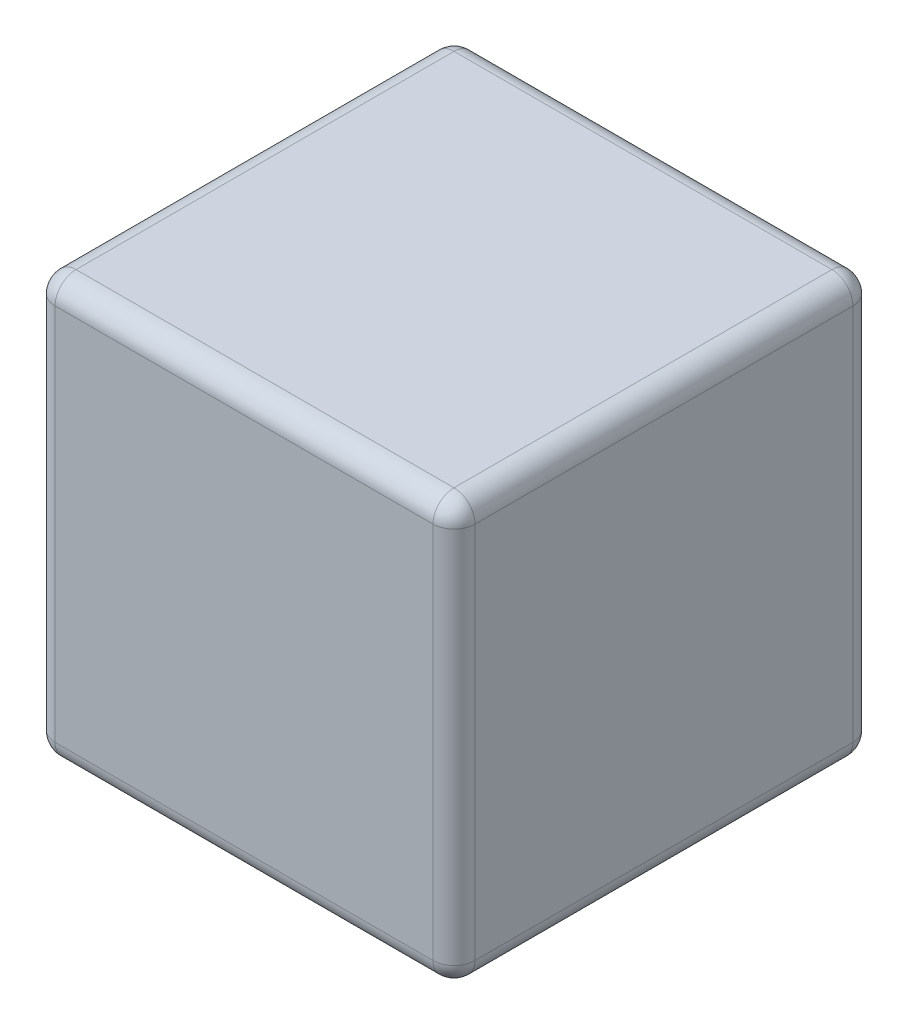
ISO-10303-21;
HEADER;
FILE_DESCRIPTION(('STEP AP214'),'2;1');
FILE_NAME('part.step','',(''),(''),'','','');
FILE_SCHEMA(('AUTOMOTIVE_DESIGN { 1 0 10303 214 1 1 1 1 }'));
ENDSEC;
DATA;
#1=APPLICATION_CONTEXT('core data for automotive mechanical design processes');
#2=APPLICATION_PROTOCOL_DEFINITION('international standard','automotive_design',2000,#1);
#3=PRODUCT_CONTEXT('',#1,'mechanical');
#4=PRODUCT('Part','Part','',(#3));
#5=PRODUCT_RELATED_PRODUCT_CATEGORY('part','',(#4));
#6=PRODUCT_DEFINITION_FORMATION('','',#4);
#7=PRODUCT_DEFINITION_CONTEXT('part definition',#1,'design');
#8=PRODUCT_DEFINITION('design','',#6,#7);
#9=PRODUCT_DEFINITION_SHAPE('','',#8);
#10=(LENGTH_UNIT() NAMED_UNIT(*) SI_UNIT(.MILLI.,.METRE.));
#11=(NAMED_UNIT(*) PLANE_ANGLE_UNIT() SI_UNIT($,.RADIAN.));
#12=(NAMED_UNIT(*) SI_UNIT($,.STERADIAN.) SOLID_ANGLE_UNIT());
#13=UNCERTAINTY_MEASURE_WITH_UNIT(LENGTH_MEASURE(1.E-05),#10,'distance_accuracy_value','');
#14=(GEOMETRIC_REPRESENTATION_CONTEXT(3) GLOBAL_UNCERTAINTY_ASSIGNED_CONTEXT((#13)) GLOBAL_UNIT_ASSIGNED_CONTEXT((#10,
#11,#12)) REPRESENTATION_CONTEXT('',''));
#15=CARTESIAN_POINT('',(0.,0.,0.));
#16=DIRECTION('',(0.,0.,1.));
#17=DIRECTION('',(1.,0.,0.));
#18=AXIS2_PLACEMENT_3D('',#15,#16,#17);
#19=CARTESIAN_POINT('',(-5.,-5.,5.));
#20=DIRECTION('',(0.,0.,1.));
#21=DIRECTION('',(1.,0.,0.));
#22=AXIS2_PLACEMENT_3D('',#19,#20,#21);
#23=PLANE('',#22);
#24=DIRECTION('',(0.,1.,0.));
#25=VECTOR('',#24,1.);
#26=CARTESIAN_POINT('',(-4.5,-5.,5.));
#27=LINE('',#26,#25);
#28=CARTESIAN_POINT('',(-4.5,4.5,5.));
#29=VERTEX_POINT('',#28);
#30=CARTESIAN_POINT('',(-4.5,-4.5,5.));
#31=VERTEX_POINT('',#30);
#32=EDGE_CURVE('E185',#29,#31,#27,.F.);
#33=ORIENTED_EDGE('',*,*,#32,.T.);
#34=DIRECTION('',(1.,0.,0.));
#35=VECTOR('',#34,1.);
#36=CARTESIAN_POINT('',(5.,-4.5,5.));
#37=LINE('',#36,#35);
#38=CARTESIAN_POINT('',(4.5,-4.5,5.));
#39=VERTEX_POINT('',#38);
#40=EDGE_CURVE('E139',#31,#39,#37,.T.);
#41=ORIENTED_EDGE('',*,*,#40,.T.);
#42=DIRECTION('',(0.,1.,0.));
#43=VECTOR('',#42,1.);
#44=CARTESIAN_POINT('',(4.5,-5.,5.));
#45=LINE('',#44,#43);
#46=CARTESIAN_POINT('',(4.5,4.5,5.));
#47=VERTEX_POINT('',#46);
#48=EDGE_CURVE('E187',#39,#47,#45,.T.);
#49=ORIENTED_EDGE('',*,*,#48,.T.);
#50=DIRECTION('',(1.,0.,0.));
#51=VECTOR('',#50,1.);
#52=CARTESIAN_POINT('',(-5.,4.5,5.));
#53=LINE('',#52,#51);
#54=EDGE_CURVE('E183',#47,#29,#53,.F.);
#55=ORIENTED_EDGE('',*,*,#54,.T.);
#56=EDGE_LOOP('',(#33,#41,#49,#55));
#57=FACE_BOUND('',#56,.T.);
#58=ADVANCED_FACE('F33',(#57),#23,.T.);
#59=CARTESIAN_POINT('',(-5.,-5.,5.));
#60=DIRECTION('',(1.,0.,0.));
#61=DIRECTION('',(0.,0.,-1.));
#62=AXIS2_PLACEMENT_3D('',#59,#60,#61);
#63=PLANE('',#62);
#64=DIRECTION('',(0.,1.,0.));
#65=VECTOR('',#64,1.);
#66=CARTESIAN_POINT('',(-5.,-5.,-4.5));
#67=LINE('',#66,#65);
#68=CARTESIAN_POINT('',(-5.,4.5,-4.5));
#69=VERTEX_POINT('',#68);
#70=CARTESIAN_POINT('',(-5.,-4.5,-4.5));
#71=VERTEX_POINT('',#70);
#72=EDGE_CURVE('E194',#69,#71,#67,.F.);
#73=ORIENTED_EDGE('',*,*,#72,.T.);
#74=DIRECTION('',(0.,0.,-1.));
#75=VECTOR('',#74,1.);
#76=CARTESIAN_POINT('',(-5.,-4.5,5.));
#77=LINE('',#76,#75);
#78=CARTESIAN_POINT('',(-5.,-4.5,4.5));
#79=VERTEX_POINT('',#78);
#80=EDGE_CURVE('E196',#71,#79,#77,.F.);
#81=ORIENTED_EDGE('',*,*,#80,.T.);
#82=DIRECTION('',(0.,1.,0.));
#83=VECTOR('',#82,1.);
#84=CARTESIAN_POINT('',(-5.,5.,4.5));
#85=LINE('',#84,#83);
#86=CARTESIAN_POINT('',(-5.,4.5,4.5));
#87=VERTEX_POINT('',#86);
#88=EDGE_CURVE('E192',#79,#87,#85,.T.);
#89=ORIENTED_EDGE('',*,*,#88,.T.);
#90=DIRECTION('',(0.,0.,-1.));
#91=VECTOR('',#90,1.);
#92=CARTESIAN_POINT('',(-5.,4.5,-5.));
#93=LINE('',#92,#91);
#94=EDGE_CURVE('E190',#87,#69,#93,.T.);
#95=ORIENTED_EDGE('',*,*,#94,.T.);
#96=EDGE_LOOP('',(#73,#81,#89,#95));
#97=FACE_BOUND('',#96,.T.);
#98=ADVANCED_FACE('F300',(#97),#63,.F.);
#99=CARTESIAN_POINT('',(-5.,-5.,-5.));
#100=DIRECTION('',(0.,0.,1.));
#101=DIRECTION('',(1.,0.,0.));
#102=AXIS2_PLACEMENT_3D('',#99,#100,#101);
#103=PLANE('',#102);
#104=DIRECTION('',(0.,1.,0.));
#105=VECTOR('',#104,1.);
#106=CARTESIAN_POINT('',(4.5,-5.,-5.));
#107=LINE('',#106,#105);
#108=CARTESIAN_POINT('',(4.5,4.5,-5.));
#109=VERTEX_POINT('',#108);
#110=CARTESIAN_POINT('',(4.5,-4.5,-5.));
#111=VERTEX_POINT('',#110);
#112=EDGE_CURVE('E169',#109,#111,#107,.F.);
#113=ORIENTED_EDGE('',*,*,#112,.T.);
#114=DIRECTION('',(1.,0.,0.));
#115=VECTOR('',#114,1.);
#116=CARTESIAN_POINT('',(-5.,-4.5,-5.));
#117=LINE('',#116,#115);
#118=CARTESIAN_POINT('',(-4.5,-4.5,-5.));
#119=VERTEX_POINT('',#118);
#120=EDGE_CURVE('E171',#111,#119,#117,.F.);
#121=ORIENTED_EDGE('',*,*,#120,.T.);
#122=DIRECTION('',(0.,1.,0.));
#123=VECTOR('',#122,1.);
#124=CARTESIAN_POINT('',(-4.5,-5.,-5.));
#125=LINE('',#124,#123);
#126=CARTESIAN_POINT('',(-4.5,4.5,-5.));
#127=VERTEX_POINT('',#126);
#128=EDGE_CURVE('E167',#119,#127,#125,.T.);
#129=ORIENTED_EDGE('',*,*,#128,.T.);
#130=DIRECTION('',(1.,0.,0.));
#131=VECTOR('',#130,1.);
#132=CARTESIAN_POINT('',(5.,4.5,-5.));
#133=LINE('',#132,#131);
#134=EDGE_CURVE('E165',#127,#109,#133,.T.);
#135=ORIENTED_EDGE('',*,*,#134,.T.);
#136=EDGE_LOOP('',(#113,#121,#129,#135));
#137=FACE_BOUND('',#136,.T.);
#138=ADVANCED_FACE('F305',(#137),#103,.F.);
#139=CARTESIAN_POINT('',(5.,-5.,5.));
#140=DIRECTION('',(1.,0.,0.));
#141=DIRECTION('',(0.,0.,-1.));
#142=AXIS2_PLACEMENT_3D('',#139,#140,#141);
#143=PLANE('',#142);
#144=DIRECTION('',(0.,1.,0.));
#145=VECTOR('',#144,1.);
#146=CARTESIAN_POINT('',(5.,-5.,4.5));
#147=LINE('',#146,#145);
#148=CARTESIAN_POINT('',(5.,4.5,4.5));
#149=VERTEX_POINT('',#148);
#150=CARTESIAN_POINT('',(5.,-4.5,4.5));
#151=VERTEX_POINT('',#150);
#152=EDGE_CURVE('E176',#149,#151,#147,.F.);
#153=ORIENTED_EDGE('',*,*,#152,.T.);
#154=DIRECTION('',(0.,0.,-1.));
#155=VECTOR('',#154,1.);
#156=CARTESIAN_POINT('',(5.,-4.5,-5.));
#157=LINE('',#156,#155);
#158=CARTESIAN_POINT('',(5.,-4.5,-4.5));
#159=VERTEX_POINT('',#158);
#160=EDGE_CURVE('E180',#151,#159,#157,.T.);
#161=ORIENTED_EDGE('',*,*,#160,.T.);
#162=DIRECTION('',(0.,1.,0.));
#163=VECTOR('',#162,1.);
#164=CARTESIAN_POINT('',(5.,5.,-4.5));
#165=LINE('',#164,#163);
#166=CARTESIAN_POINT('',(5.,4.5,-4.5));
#167=VERTEX_POINT('',#166);
#168=EDGE_CURVE('E178',#159,#167,#165,.T.);
#169=ORIENTED_EDGE('',*,*,#168,.T.);
#170=DIRECTION('',(0.,0.,-1.));
#171=VECTOR('',#170,1.);
#172=CARTESIAN_POINT('',(5.,4.5,5.));
#173=LINE('',#172,#171);
#174=EDGE_CURVE('E174',#167,#149,#173,.F.);
#175=ORIENTED_EDGE('',*,*,#174,.T.);
#176=EDGE_LOOP('',(#153,#161,#169,#175));
#177=FACE_BOUND('',#176,.T.);
#178=ADVANCED_FACE('F265',(#177),#143,.T.);
#179=CARTESIAN_POINT('',(0.,-5.,0.));
#180=DIRECTION('',(0.,1.,0.));
#181=DIRECTION('',(0.,0.,1.));
#182=AXIS2_PLACEMENT_3D('',#179,#180,#181);
#183=PLANE('',#182);
#184=DIRECTION('',(0.,0.,-1.));
#185=VECTOR('',#184,1.);
#186=CARTESIAN_POINT('',(-4.5,-5.,0.));
#187=LINE('',#186,#185);
#188=CARTESIAN_POINT('',(-4.5,-5.,4.5));
#189=VERTEX_POINT('',#188);
#190=CARTESIAN_POINT('',(-4.5,-5.,-4.5));
#191=VERTEX_POINT('',#190);
#192=EDGE_CURVE('E125',#189,#191,#187,.T.);
#193=ORIENTED_EDGE('',*,*,#192,.T.);
#194=DIRECTION('',(1.,0.,0.));
#195=VECTOR('',#194,1.);
#196=CARTESIAN_POINT('',(0.,-5.,-4.5));
#197=LINE('',#196,#195);
#198=CARTESIAN_POINT('',(4.5,-5.,-4.5));
#199=VERTEX_POINT('',#198);
#200=EDGE_CURVE('E163',#191,#199,#197,.T.);
#201=ORIENTED_EDGE('',*,*,#200,.T.);
#202=DIRECTION('',(0.,0.,-1.));
#203=VECTOR('',#202,1.);
#204=CARTESIAN_POINT('',(4.5,-5.,5.));
#205=LINE('',#204,#203);
#206=CARTESIAN_POINT('',(4.5,-5.,4.5));
#207=VERTEX_POINT('',#206);
#208=EDGE_CURVE('E128',#199,#207,#205,.F.);
#209=ORIENTED_EDGE('',*,*,#208,.T.);
#210=DIRECTION('',(1.,0.,0.));
#211=VECTOR('',#210,1.);
#212=CARTESIAN_POINT('',(-5.,-5.,4.5));
#213=LINE('',#212,#211);
#214=EDGE_CURVE('E120',#207,#189,#213,.F.);
#215=ORIENTED_EDGE('',*,*,#214,.T.);
#216=EDGE_LOOP('',(#193,#201,#209,#215));
#217=FACE_BOUND('',#216,.T.);
#218=ADVANCED_FACE('F122',(#217),#183,.F.);
#219=CARTESIAN_POINT('',(0.,5.,0.));
#220=DIRECTION('',(0.,1.,0.));
#221=DIRECTION('',(0.,0.,1.));
#222=AXIS2_PLACEMENT_3D('',#219,#220,#221);
#223=PLANE('',#222);
#224=DIRECTION('',(1.,0.,0.));
#225=VECTOR('',#224,1.);
#226=CARTESIAN_POINT('',(-5.,5.,-4.5));
#227=LINE('',#226,#225);
#228=CARTESIAN_POINT('',(4.5,5.,-4.5));
#229=VERTEX_POINT('',#228);
#230=CARTESIAN_POINT('',(-4.5,5.,-4.5));
#231=VERTEX_POINT('',#230);
#232=EDGE_CURVE('E42',#229,#231,#227,.F.);
#233=ORIENTED_EDGE('',*,*,#232,.T.);
#234=DIRECTION('',(0.,0.,-1.));
#235=VECTOR('',#234,1.);
#236=CARTESIAN_POINT('',(-4.5,5.,5.));
#237=LINE('',#236,#235);
#238=CARTESIAN_POINT('',(-4.5,5.,4.5));
#239=VERTEX_POINT('',#238);
#240=EDGE_CURVE('E11',#231,#239,#237,.F.);
#241=ORIENTED_EDGE('',*,*,#240,.T.);
#242=DIRECTION('',(1.,0.,0.));
#243=VECTOR('',#242,1.);
#244=CARTESIAN_POINT('',(0.,5.,4.5));
#245=LINE('',#244,#243);
#246=CARTESIAN_POINT('',(4.5,5.,4.5));
#247=VERTEX_POINT('',#246);
#248=EDGE_CURVE('E199',#239,#247,#245,.T.);
#249=ORIENTED_EDGE('',*,*,#248,.T.);
#250=DIRECTION('',(0.,0.,-1.));
#251=VECTOR('',#250,1.);
#252=CARTESIAN_POINT('',(4.5,5.,0.));
#253=LINE('',#252,#251);
#254=EDGE_CURVE('E53',#247,#229,#253,.T.);
#255=ORIENTED_EDGE('',*,*,#254,.T.);
#256=EDGE_LOOP('',(#233,#241,#249,#255));
#257=FACE_BOUND('',#256,.T.);
#258=ADVANCED_FACE('F290',(#257),#223,.T.);
#259=CARTESIAN_POINT('',(0.,4.5,4.5));
#260=DIRECTION('',(1.,0.,0.));
#261=DIRECTION('',(0.,0.,-1.));
#262=AXIS2_PLACEMENT_3D('',#259,#260,#261);
#263=CYLINDRICAL_SURFACE('',#262,0.5);
#264=CARTESIAN_POINT('',(-4.5,4.5,4.5));
#265=DIRECTION('',(-1.,0.,0.));
#266=DIRECTION('',(0.,0.,1.));
#267=AXIS2_PLACEMENT_3D('',#264,#265,#266);
#268=CIRCLE('',#267,0.5);
#269=EDGE_CURVE('E37',#29,#239,#268,.T.);
#270=ORIENTED_EDGE('',*,*,#269,.F.);
#271=ORIENTED_EDGE('',*,*,#54,.F.);
#272=CARTESIAN_POINT('',(4.5,4.5,4.5));
#273=DIRECTION('',(1.,0.,0.));
#274=DIRECTION('',(0.,0.,-1.));
#275=AXIS2_PLACEMENT_3D('',#272,#273,#274);
#276=CIRCLE('',#275,0.5);
#277=EDGE_CURVE('E160',#247,#47,#276,.T.);
#278=ORIENTED_EDGE('',*,*,#277,.F.);
#279=ORIENTED_EDGE('',*,*,#248,.F.);
#280=EDGE_LOOP('',(#270,#271,#278,#279));
#281=FACE_BOUND('',#280,.T.);
#282=ADVANCED_FACE('F35',(#281),#263,.T.);
#283=CARTESIAN_POINT('',(-4.5,4.5,4.5));
#284=DIRECTION('',(0.,0.,1.));
#285=DIRECTION('',(1.,0.,0.));
#286=AXIS2_PLACEMENT_3D('',#283,#284,#285);
#287=SPHERICAL_SURFACE('',#286,0.5);
#288=CARTESIAN_POINT('',(-4.5,4.5,4.5));
#289=DIRECTION('',(0.,1.,0.));
#290=DIRECTION('',(0.,0.,1.));
#291=AXIS2_PLACEMENT_3D('',#288,#289,#290);
#292=CIRCLE('',#291,0.5);
#293=EDGE_CURVE('E245',#29,#87,#292,.F.);
#294=ORIENTED_EDGE('',*,*,#293,.F.);
#295=ORIENTED_EDGE('',*,*,#269,.T.);
#296=CARTESIAN_POINT('',(-4.5,4.5,4.5));
#297=DIRECTION('',(0.,0.,1.));
#298=DIRECTION('',(1.,0.,0.));
#299=AXIS2_PLACEMENT_3D('',#296,#297,#298);
#300=CIRCLE('',#299,0.5);
#301=EDGE_CURVE('E248',#87,#239,#300,.F.);
#302=ORIENTED_EDGE('',*,*,#301,.F.);
#303=EDGE_LOOP('',(#294,#295,#302));
#304=FACE_BOUND('',#303,.T.);
#305=ADVANCED_FACE('F295',(#304),#287,.T.);
#306=CARTESIAN_POINT('',(4.5,4.5,4.5));
#307=DIRECTION('',(0.,0.,1.));
#308=DIRECTION('',(1.,0.,0.));
#309=AXIS2_PLACEMENT_3D('',#306,#307,#308);
#310=SPHERICAL_SURFACE('',#309,0.5);
#311=CARTESIAN_POINT('',(4.5,4.5,4.5));
#312=DIRECTION('',(0.,0.,1.));
#313=DIRECTION('',(1.,0.,0.));
#314=AXIS2_PLACEMENT_3D('',#311,#312,#313);
#315=CIRCLE('',#314,0.5);
#316=EDGE_CURVE('E239',#247,#149,#315,.F.);
#317=ORIENTED_EDGE('',*,*,#316,.F.);
#318=ORIENTED_EDGE('',*,*,#277,.T.);
#319=CARTESIAN_POINT('',(4.5,4.5,4.5));
#320=DIRECTION('',(0.,1.,0.));
#321=DIRECTION('',(0.,0.,1.));
#322=AXIS2_PLACEMENT_3D('',#319,#320,#321);
#323=CIRCLE('',#322,0.5);
#324=EDGE_CURVE('E242',#149,#47,#323,.F.);
#325=ORIENTED_EDGE('',*,*,#324,.F.);
#326=EDGE_LOOP('',(#317,#318,#325));
#327=FACE_BOUND('',#326,.T.);
#328=ADVANCED_FACE('F254',(#327),#310,.T.);
#329=CARTESIAN_POINT('',(-4.5,4.5,5.));
#330=DIRECTION('',(0.,0.,1.));
#331=DIRECTION('',(1.,0.,0.));
#332=AXIS2_PLACEMENT_3D('',#329,#330,#331);
#333=CYLINDRICAL_SURFACE('',#332,0.5);
#334=ORIENTED_EDGE('',*,*,#301,.T.);
#335=ORIENTED_EDGE('',*,*,#240,.F.);
#336=CARTESIAN_POINT('',(-4.5,4.5,-4.5));
#337=DIRECTION('',(0.,0.,-1.));
#338=DIRECTION('',(-1.,0.,0.));
#339=AXIS2_PLACEMENT_3D('',#336,#337,#338);
#340=CIRCLE('',#339,0.5);
#341=EDGE_CURVE('E233',#69,#231,#340,.T.);
#342=ORIENTED_EDGE('',*,*,#341,.F.);
#343=ORIENTED_EDGE('',*,*,#94,.F.);
#344=EDGE_LOOP('',(#334,#335,#342,#343));
#345=FACE_BOUND('',#344,.T.);
#346=ADVANCED_FACE('F288',(#345),#333,.T.);
#347=CARTESIAN_POINT('',(-4.5,-5.,4.5));
#348=DIRECTION('',(0.,-1.,0.));
#349=DIRECTION('',(0.,0.,-1.));
#350=AXIS2_PLACEMENT_3D('',#347,#348,#349);
#351=CYLINDRICAL_SURFACE('',#350,0.5);
#352=ORIENTED_EDGE('',*,*,#293,.T.);
#353=ORIENTED_EDGE('',*,*,#88,.F.);
#354=CARTESIAN_POINT('',(-4.5,-4.5,4.5));
#355=DIRECTION('',(0.,-1.,0.));
#356=DIRECTION('',(0.,0.,-1.));
#357=AXIS2_PLACEMENT_3D('',#354,#355,#356);
#358=CIRCLE('',#357,0.5);
#359=EDGE_CURVE('E143',#31,#79,#358,.T.);
#360=ORIENTED_EDGE('',*,*,#359,.F.);
#361=ORIENTED_EDGE('',*,*,#32,.F.);
#362=EDGE_LOOP('',(#352,#353,#360,#361));
#363=FACE_BOUND('',#362,.T.);
#364=ADVANCED_FACE('F297',(#363),#351,.T.);
#365=CARTESIAN_POINT('',(-5.,-4.5,4.5));
#366=DIRECTION('',(-1.,0.,0.));
#367=DIRECTION('',(0.,0.,1.));
#368=AXIS2_PLACEMENT_3D('',#365,#366,#367);
#369=CYLINDRICAL_SURFACE('',#368,0.5);
#370=CARTESIAN_POINT('',(4.5,-4.5,4.5));
#371=DIRECTION('',(1.,0.,0.));
#372=DIRECTION('',(0.,0.,-1.));
#373=AXIS2_PLACEMENT_3D('',#370,#371,#372);
#374=CIRCLE('',#373,0.5);
#375=EDGE_CURVE('E144',#39,#207,#374,.T.);
#376=ORIENTED_EDGE('',*,*,#375,.F.);
#377=ORIENTED_EDGE('',*,*,#40,.F.);
#378=CARTESIAN_POINT('',(-4.5,-4.5,4.5));
#379=DIRECTION('',(-1.,0.,0.));
#380=DIRECTION('',(0.,0.,1.));
#381=AXIS2_PLACEMENT_3D('',#378,#379,#380);
#382=CIRCLE('',#381,0.5);
#383=EDGE_CURVE('E135',#189,#31,#382,.T.);
#384=ORIENTED_EDGE('',*,*,#383,.F.);
#385=ORIENTED_EDGE('',*,*,#214,.F.);
#386=EDGE_LOOP('',(#376,#377,#384,#385));
#387=FACE_BOUND('',#386,.T.);
#388=ADVANCED_FACE('F137',(#387),#369,.T.);
#389=CARTESIAN_POINT('',(4.5,-5.,4.5));
#390=DIRECTION('',(0.,1.,0.));
#391=DIRECTION('',(0.,0.,1.));
#392=AXIS2_PLACEMENT_3D('',#389,#390,#391);
#393=CYLINDRICAL_SURFACE('',#392,0.5);
#394=ORIENTED_EDGE('',*,*,#324,.T.);
#395=ORIENTED_EDGE('',*,*,#48,.F.);
#396=CARTESIAN_POINT('',(4.5,-4.5,4.5));
#397=DIRECTION('',(0.,-1.,0.));
#398=DIRECTION('',(0.,0.,-1.));
#399=AXIS2_PLACEMENT_3D('',#396,#397,#398);
#400=CIRCLE('',#399,0.5);
#401=EDGE_CURVE('E229',#151,#39,#400,.T.);
#402=ORIENTED_EDGE('',*,*,#401,.F.);
#403=ORIENTED_EDGE('',*,*,#152,.F.);
#404=EDGE_LOOP('',(#394,#395,#402,#403));
#405=FACE_BOUND('',#404,.T.);
#406=ADVANCED_FACE('F261',(#405),#393,.T.);
#407=CARTESIAN_POINT('',(4.5,4.5,0.));
#408=DIRECTION('',(0.,0.,-1.));
#409=DIRECTION('',(-1.,0.,0.));
#410=AXIS2_PLACEMENT_3D('',#407,#408,#409);
#411=CYLINDRICAL_SURFACE('',#410,0.5);
#412=ORIENTED_EDGE('',*,*,#316,.T.);
#413=ORIENTED_EDGE('',*,*,#174,.F.);
#414=CARTESIAN_POINT('',(4.5,4.5,-4.5));
#415=DIRECTION('',(0.,0.,-1.));
#416=DIRECTION('',(-1.,0.,0.));
#417=AXIS2_PLACEMENT_3D('',#414,#415,#416);
#418=CIRCLE('',#417,0.5);
#419=EDGE_CURVE('E226',#229,#167,#418,.T.);
#420=ORIENTED_EDGE('',*,*,#419,.F.);
#421=ORIENTED_EDGE('',*,*,#254,.F.);
#422=EDGE_LOOP('',(#412,#413,#420,#421));
#423=FACE_BOUND('',#422,.T.);
#424=ADVANCED_FACE('F271',(#423),#411,.T.);
#425=CARTESIAN_POINT('',(-5.,4.5,-4.5));
#426=DIRECTION('',(-1.,0.,0.));
#427=DIRECTION('',(0.,0.,1.));
#428=AXIS2_PLACEMENT_3D('',#425,#426,#427);
#429=CYLINDRICAL_SURFACE('',#428,0.5);
#430=CARTESIAN_POINT('',(-4.5,4.5,-4.5));
#431=DIRECTION('',(-1.,0.,0.));
#432=DIRECTION('',(0.,0.,1.));
#433=AXIS2_PLACEMENT_3D('',#430,#431,#432);
#434=CIRCLE('',#433,0.5);
#435=EDGE_CURVE('E236',#231,#127,#434,.T.);
#436=ORIENTED_EDGE('',*,*,#435,.F.);
#437=ORIENTED_EDGE('',*,*,#232,.F.);
#438=CARTESIAN_POINT('',(4.5,4.5,-4.5));
#439=DIRECTION('',(1.,0.,0.));
#440=DIRECTION('',(0.,0.,-1.));
#441=AXIS2_PLACEMENT_3D('',#438,#439,#440);
#442=CIRCLE('',#441,0.5);
#443=EDGE_CURVE('E223',#109,#229,#442,.T.);
#444=ORIENTED_EDGE('',*,*,#443,.F.);
#445=ORIENTED_EDGE('',*,*,#134,.F.);
#446=EDGE_LOOP('',(#436,#437,#444,#445));
#447=FACE_BOUND('',#446,.T.);
#448=ADVANCED_FACE('F280',(#447),#429,.T.);
#449=CARTESIAN_POINT('',(-4.5,4.5,-4.5));
#450=DIRECTION('',(0.,0.,1.));
#451=DIRECTION('',(1.,0.,0.));
#452=AXIS2_PLACEMENT_3D('',#449,#450,#451);
#453=SPHERICAL_SURFACE('',#452,0.5);
#454=ORIENTED_EDGE('',*,*,#341,.T.);
#455=ORIENTED_EDGE('',*,*,#435,.T.);
#456=CARTESIAN_POINT('',(-4.5,4.5,-4.5));
#457=DIRECTION('',(0.,1.,0.));
#458=DIRECTION('',(0.,0.,1.));
#459=AXIS2_PLACEMENT_3D('',#456,#457,#458);
#460=CIRCLE('',#459,0.5);
#461=EDGE_CURVE('E151',#69,#127,#460,.F.);
#462=ORIENTED_EDGE('',*,*,#461,.F.);
#463=EDGE_LOOP('',(#454,#455,#462));
#464=FACE_BOUND('',#463,.T.);
#465=ADVANCED_FACE('F284',(#464),#453,.T.);
#466=CARTESIAN_POINT('',(-4.5,-4.5,4.5));
#467=DIRECTION('',(0.,0.,1.));
#468=DIRECTION('',(1.,0.,0.));
#469=AXIS2_PLACEMENT_3D('',#466,#467,#468);
#470=SPHERICAL_SURFACE('',#469,0.5);
#471=ORIENTED_EDGE('',*,*,#383,.T.);
#472=ORIENTED_EDGE('',*,*,#359,.T.);
#473=CARTESIAN_POINT('',(-4.5,-4.5,4.5));
#474=DIRECTION('',(0.,0.,1.));
#475=DIRECTION('',(1.,0.,0.));
#476=AXIS2_PLACEMENT_3D('',#473,#474,#475);
#477=CIRCLE('',#476,0.5);
#478=EDGE_CURVE('E146',#189,#79,#477,.F.);
#479=ORIENTED_EDGE('',*,*,#478,.F.);
#480=EDGE_LOOP('',(#471,#472,#479));
#481=FACE_BOUND('',#480,.T.);
#482=ADVANCED_FACE('F147',(#481),#470,.T.);
#483=CARTESIAN_POINT('',(4.5,-4.5,4.5));
#484=DIRECTION('',(0.,0.,1.));
#485=DIRECTION('',(1.,0.,0.));
#486=AXIS2_PLACEMENT_3D('',#483,#484,#485);
#487=SPHERICAL_SURFACE('',#486,0.5);
#488=ORIENTED_EDGE('',*,*,#401,.T.);
#489=ORIENTED_EDGE('',*,*,#375,.T.);
#490=CARTESIAN_POINT('',(4.5,-4.5,4.5));
#491=DIRECTION('',(0.,0.,1.));
#492=DIRECTION('',(1.,0.,0.));
#493=AXIS2_PLACEMENT_3D('',#490,#491,#492);
#494=CIRCLE('',#493,0.5);
#495=EDGE_CURVE('E152',#151,#207,#494,.F.);
#496=ORIENTED_EDGE('',*,*,#495,.F.);
#497=EDGE_LOOP('',(#488,#489,#496));
#498=FACE_BOUND('',#497,.T.);
#499=ADVANCED_FACE('F339',(#498),#487,.T.);
#500=CARTESIAN_POINT('',(4.5,4.5,-4.5));
#501=DIRECTION('',(0.,0.,1.));
#502=DIRECTION('',(1.,0.,0.));
#503=AXIS2_PLACEMENT_3D('',#500,#501,#502);
#504=SPHERICAL_SURFACE('',#503,0.5);
#505=ORIENTED_EDGE('',*,*,#443,.T.);
#506=ORIENTED_EDGE('',*,*,#419,.T.);
#507=CARTESIAN_POINT('',(4.5,4.5,-4.5));
#508=DIRECTION('',(0.,1.,0.));
#509=DIRECTION('',(0.,0.,1.));
#510=AXIS2_PLACEMENT_3D('',#507,#508,#509);
#511=CIRCLE('',#510,0.5);
#512=EDGE_CURVE('E216',#109,#167,#511,.F.);
#513=ORIENTED_EDGE('',*,*,#512,.F.);
#514=EDGE_LOOP('',(#505,#506,#513));
#515=FACE_BOUND('',#514,.T.);
#516=ADVANCED_FACE('F275',(#515),#504,.T.);
#517=CARTESIAN_POINT('',(-4.5,-5.,-4.5));
#518=DIRECTION('',(0.,1.,0.));
#519=DIRECTION('',(0.,0.,1.));
#520=AXIS2_PLACEMENT_3D('',#517,#518,#519);
#521=CYLINDRICAL_SURFACE('',#520,0.5);
#522=ORIENTED_EDGE('',*,*,#461,.T.);
#523=ORIENTED_EDGE('',*,*,#128,.F.);
#524=CARTESIAN_POINT('',(-4.5,-4.5,-4.5));
#525=DIRECTION('',(0.,-1.,0.));
#526=DIRECTION('',(0.,0.,-1.));
#527=AXIS2_PLACEMENT_3D('',#524,#525,#526);
#528=CIRCLE('',#527,0.5);
#529=EDGE_CURVE('E213',#71,#119,#528,.T.);
#530=ORIENTED_EDGE('',*,*,#529,.F.);
#531=ORIENTED_EDGE('',*,*,#72,.F.);
#532=EDGE_LOOP('',(#522,#523,#530,#531));
#533=FACE_BOUND('',#532,.T.);
#534=ADVANCED_FACE('F333',(#533),#521,.T.);
#535=CARTESIAN_POINT('',(-4.5,-4.5,0.));
#536=DIRECTION('',(0.,0.,-1.));
#537=DIRECTION('',(-1.,0.,0.));
#538=AXIS2_PLACEMENT_3D('',#535,#536,#537);
#539=CYLINDRICAL_SURFACE('',#538,0.5);
#540=ORIENTED_EDGE('',*,*,#478,.T.);
#541=ORIENTED_EDGE('',*,*,#80,.F.);
#542=CARTESIAN_POINT('',(-4.5,-4.5,-4.5));
#543=DIRECTION('',(0.,0.,-1.));
#544=DIRECTION('',(-1.,0.,0.));
#545=AXIS2_PLACEMENT_3D('',#542,#543,#544);
#546=CIRCLE('',#545,0.5);
#547=EDGE_CURVE('E156',#191,#71,#546,.T.);
#548=ORIENTED_EDGE('',*,*,#547,.F.);
#549=ORIENTED_EDGE('',*,*,#192,.F.);
#550=EDGE_LOOP('',(#540,#541,#548,#549));
#551=FACE_BOUND('',#550,.T.);
#552=ADVANCED_FACE('F154',(#551),#539,.T.);
#553=CARTESIAN_POINT('',(4.5,-4.5,5.));
#554=DIRECTION('',(0.,0.,1.));
#555=DIRECTION('',(1.,0.,0.));
#556=AXIS2_PLACEMENT_3D('',#553,#554,#555);
#557=CYLINDRICAL_SURFACE('',#556,0.5);
#558=ORIENTED_EDGE('',*,*,#495,.T.);
#559=ORIENTED_EDGE('',*,*,#208,.F.);
#560=CARTESIAN_POINT('',(4.5,-4.5,-4.5));
#561=DIRECTION('',(0.,0.,-1.));
#562=DIRECTION('',(0.,1.,0.));
#563=AXIS2_PLACEMENT_3D('',#560,#561,#562);
#564=CIRCLE('',#563,0.5);
#565=EDGE_CURVE('E209',#159,#199,#564,.T.);
#566=ORIENTED_EDGE('',*,*,#565,.F.);
#567=ORIENTED_EDGE('',*,*,#160,.F.);
#568=EDGE_LOOP('',(#558,#559,#566,#567));
#569=FACE_BOUND('',#568,.T.);
#570=ADVANCED_FACE('F326',(#569),#557,.T.);
#571=CARTESIAN_POINT('',(4.5,-5.,-4.5));
#572=DIRECTION('',(0.,-1.,0.));
#573=DIRECTION('',(0.,0.,-1.));
#574=AXIS2_PLACEMENT_3D('',#571,#572,#573);
#575=CYLINDRICAL_SURFACE('',#574,0.5);
#576=ORIENTED_EDGE('',*,*,#512,.T.);
#577=ORIENTED_EDGE('',*,*,#168,.F.);
#578=CARTESIAN_POINT('',(4.5,-4.5,-4.5));
#579=DIRECTION('',(0.,-1.,0.));
#580=DIRECTION('',(0.,0.,-1.));
#581=AXIS2_PLACEMENT_3D('',#578,#579,#580);
#582=CIRCLE('',#581,0.5);
#583=EDGE_CURVE('E207',#111,#159,#582,.T.);
#584=ORIENTED_EDGE('',*,*,#583,.F.);
#585=ORIENTED_EDGE('',*,*,#112,.F.);
#586=EDGE_LOOP('',(#576,#577,#584,#585));
#587=FACE_BOUND('',#586,.T.);
#588=ADVANCED_FACE('F322',(#587),#575,.T.);
#589=CARTESIAN_POINT('',(-4.5,-4.5,-4.5));
#590=DIRECTION('',(0.,0.,1.));
#591=DIRECTION('',(1.,0.,0.));
#592=AXIS2_PLACEMENT_3D('',#589,#590,#591);
#593=SPHERICAL_SURFACE('',#592,0.5);
#594=ORIENTED_EDGE('',*,*,#547,.T.);
#595=ORIENTED_EDGE('',*,*,#529,.T.);
#596=CARTESIAN_POINT('',(-4.5,-4.5,-4.5));
#597=DIRECTION('',(-1.,0.,0.));
#598=DIRECTION('',(0.,0.,1.));
#599=AXIS2_PLACEMENT_3D('',#596,#597,#598);
#600=CIRCLE('',#599,0.5);
#601=EDGE_CURVE('E205',#191,#119,#600,.F.);
#602=ORIENTED_EDGE('',*,*,#601,.F.);
#603=EDGE_LOOP('',(#594,#595,#602));
#604=FACE_BOUND('',#603,.T.);
#605=ADVANCED_FACE('F318',(#604),#593,.T.);
#606=CARTESIAN_POINT('',(4.5,-4.5,-4.5));
#607=DIRECTION('',(0.,0.,1.));
#608=DIRECTION('',(1.,0.,0.));
#609=AXIS2_PLACEMENT_3D('',#606,#607,#608);
#610=SPHERICAL_SURFACE('',#609,0.5);
#611=ORIENTED_EDGE('',*,*,#583,.T.);
#612=ORIENTED_EDGE('',*,*,#565,.T.);
#613=CARTESIAN_POINT('',(4.5,-4.5,-4.5));
#614=DIRECTION('',(1.,0.,0.));
#615=DIRECTION('',(0.,0.,-1.));
#616=AXIS2_PLACEMENT_3D('',#613,#614,#615);
#617=CIRCLE('',#616,0.5);
#618=EDGE_CURVE('E203',#111,#199,#617,.F.);
#619=ORIENTED_EDGE('',*,*,#618,.F.);
#620=EDGE_LOOP('',(#611,#612,#619));
#621=FACE_BOUND('',#620,.T.);
#622=ADVANCED_FACE('F314',(#621),#610,.T.);
#623=CARTESIAN_POINT('',(0.,-4.5,-4.5));
#624=DIRECTION('',(1.,0.,0.));
#625=DIRECTION('',(0.,0.,-1.));
#626=AXIS2_PLACEMENT_3D('',#623,#624,#625);
#627=CYLINDRICAL_SURFACE('',#626,0.5);
#628=ORIENTED_EDGE('',*,*,#601,.T.);
#629=ORIENTED_EDGE('',*,*,#120,.F.);
#630=ORIENTED_EDGE('',*,*,#618,.T.);
#631=ORIENTED_EDGE('',*,*,#200,.F.);
#632=EDGE_LOOP('',(#628,#629,#630,#631));
#633=FACE_BOUND('',#632,.T.);
#634=ADVANCED_FACE('F311',(#633),#627,.T.);
#635=CLOSED_SHELL('',(#58,#98,#138,#178,#218,#258,#282,#305,#328,#346,#364,#388,#406,#424,#448,
#465,#482,#499,#516,#534,#552,#570,#588,#605,#622,#634));
#636=MANIFOLD_SOLID_BREP('B2',#635);
#637=ADVANCED_BREP_SHAPE_REPRESENTATION('',(#18,#636),#14);
#638=SHAPE_DEFINITION_REPRESENTATION(#9,#637);
ENDSEC;
END-ISO-10303-21;
